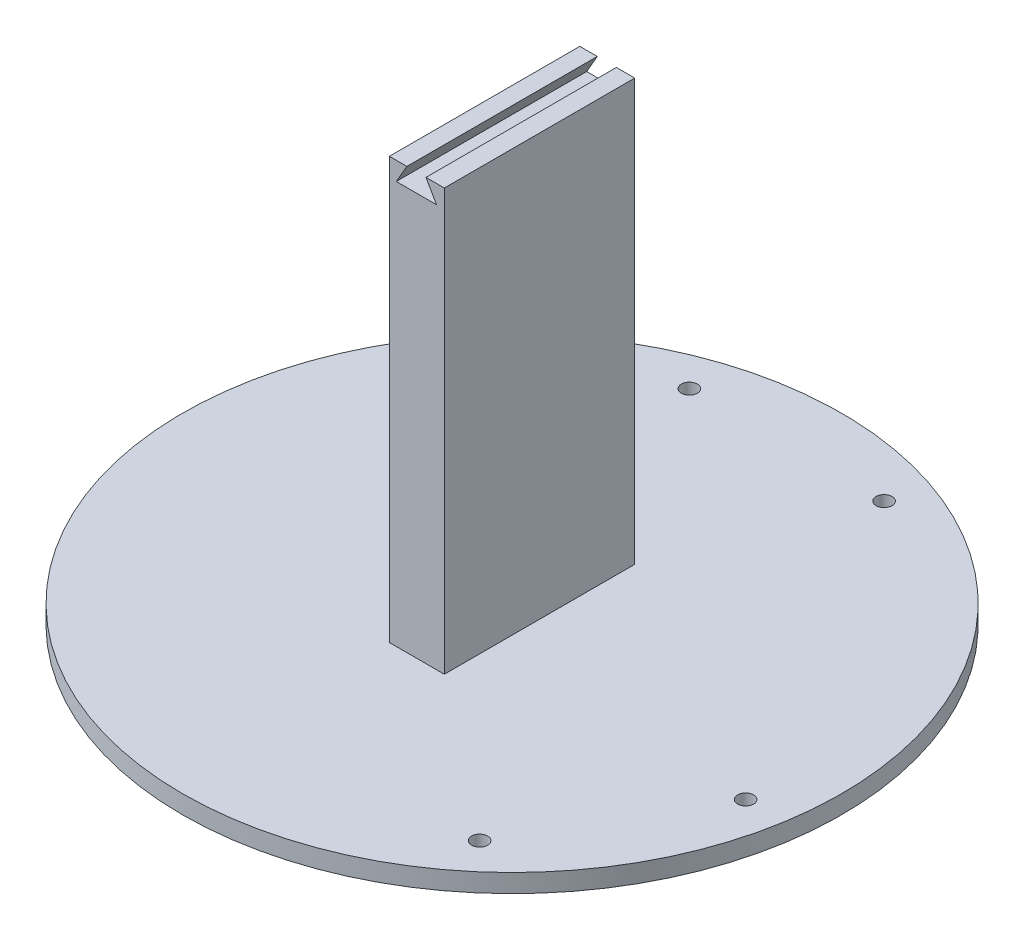
ISO-10303-21;
HEADER;
FILE_DESCRIPTION(('STEP AP214'),'2;1');
FILE_NAME('part.step','',(''),(''),'','','');
FILE_SCHEMA(('AUTOMOTIVE_DESIGN { 1 0 10303 214 1 1 1 1 }'));
ENDSEC;
DATA;
#1=APPLICATION_CONTEXT('core data for automotive mechanical design processes');
#2=APPLICATION_PROTOCOL_DEFINITION('international standard','automotive_design',2000,#1);
#3=PRODUCT_CONTEXT('',#1,'mechanical');
#4=PRODUCT('Part','Part','',(#3));
#5=PRODUCT_RELATED_PRODUCT_CATEGORY('part','',(#4));
#6=PRODUCT_DEFINITION_FORMATION('','',#4);
#7=PRODUCT_DEFINITION_CONTEXT('part definition',#1,'design');
#8=PRODUCT_DEFINITION('design','',#6,#7);
#9=PRODUCT_DEFINITION_SHAPE('','',#8);
#10=(LENGTH_UNIT() NAMED_UNIT(*) SI_UNIT(.MILLI.,.METRE.));
#11=(NAMED_UNIT(*) PLANE_ANGLE_UNIT() SI_UNIT($,.RADIAN.));
#12=(NAMED_UNIT(*) SI_UNIT($,.STERADIAN.) SOLID_ANGLE_UNIT());
#13=UNCERTAINTY_MEASURE_WITH_UNIT(LENGTH_MEASURE(1.E-05),#10,'distance_accuracy_value','');
#14=(GEOMETRIC_REPRESENTATION_CONTEXT(3) GLOBAL_UNCERTAINTY_ASSIGNED_CONTEXT((#13)) GLOBAL_UNIT_ASSIGNED_CONTEXT((#10,
#11,#12)) REPRESENTATION_CONTEXT('',''));
#15=CARTESIAN_POINT('',(0.,0.,0.));
#16=DIRECTION('',(0.,0.,1.));
#17=DIRECTION('',(1.,0.,0.));
#18=AXIS2_PLACEMENT_3D('',#15,#16,#17);
#19=CARTESIAN_POINT('',(0.,120.,0.));
#20=DIRECTION('',(0.,1.,0.));
#21=DIRECTION('',(0.,0.,1.));
#22=AXIS2_PLACEMENT_3D('',#19,#20,#21);
#23=PLANE('',#22);
#24=DIRECTION('',(0.,0.,-1.));
#25=VECTOR('',#24,1.);
#26=CARTESIAN_POINT('',(2.48264412248189,120.,0.));
#27=LINE('',#26,#25);
#28=CARTESIAN_POINT('',(2.48264412248189,120.,26.));
#29=VERTEX_POINT('',#28);
#30=CARTESIAN_POINT('',(2.48264412248189,120.,-26.));
#31=VERTEX_POINT('',#30);
#32=EDGE_CURVE('E11',#29,#31,#27,.T.);
#33=ORIENTED_EDGE('',*,*,#32,.F.);
#34=DIRECTION('',(1.,0.,0.));
#35=VECTOR('',#34,1.);
#36=CARTESIAN_POINT('',(-7.5,120.,26.));
#37=LINE('',#36,#35);
#38=CARTESIAN_POINT('',(7.5,120.,26.));
#39=VERTEX_POINT('',#38);
#40=EDGE_CURVE('E128',#29,#39,#37,.T.);
#41=ORIENTED_EDGE('',*,*,#40,.T.);
#42=DIRECTION('',(0.,0.,-1.));
#43=VECTOR('',#42,1.);
#44=CARTESIAN_POINT('',(7.5,120.,-26.));
#45=LINE('',#44,#43);
#46=CARTESIAN_POINT('',(7.5,120.,-26.));
#47=VERTEX_POINT('',#46);
#48=EDGE_CURVE('E225',#39,#47,#45,.T.);
#49=ORIENTED_EDGE('',*,*,#48,.T.);
#50=DIRECTION('',(-1.,0.,0.));
#51=VECTOR('',#50,1.);
#52=CARTESIAN_POINT('',(-7.5,120.,-26.));
#53=LINE('',#52,#51);
#54=EDGE_CURVE('E234',#47,#31,#53,.T.);
#55=ORIENTED_EDGE('',*,*,#54,.T.);
#56=EDGE_LOOP('',(#33,#41,#49,#55));
#57=FACE_BOUND('',#56,.T.);
#58=ADVANCED_FACE('F40',(#57),#23,.T.);
#59=CARTESIAN_POINT('',(0.,5.,0.));
#60=DIRECTION('',(0.,1.,0.));
#61=DIRECTION('',(0.,0.,1.));
#62=AXIS2_PLACEMENT_3D('',#59,#60,#61);
#63=PLANE('',#62);
#64=CARTESIAN_POINT('',(51.6594052838329,5.,60.5232853596093));
#65=DIRECTION('',(0.,1.,0.));
#66=DIRECTION('',(0.,0.,1.));
#67=AXIS2_PLACEMENT_3D('',#64,#65,#66);
#68=CIRCLE('',#67,2.1825);
#69=CARTESIAN_POINT('',(51.6594052838329,5.,62.7057853596093));
#70=VERTEX_POINT('',#69);
#71=EDGE_CURVE('E121',#70,#70,#68,.T.);
#72=ORIENTED_EDGE('',*,*,#71,.F.);
#73=EDGE_LOOP('',(#72));
#74=FACE_BOUND('',#73,.T.);
#75=CARTESIAN_POINT('',(78.2444052838329,5.,14.4767146403907));
#76=DIRECTION('',(0.,1.,0.));
#77=DIRECTION('',(0.,0.,1.));
#78=AXIS2_PLACEMENT_3D('',#75,#76,#77);
#79=CIRCLE('',#78,2.1825);
#80=CARTESIAN_POINT('',(78.2444052838329,5.,16.6592146403907));
#81=VERTEX_POINT('',#80);
#82=EDGE_CURVE('E307',#81,#81,#79,.T.);
#83=ORIENTED_EDGE('',*,*,#82,.F.);
#84=EDGE_LOOP('',(#83));
#85=FACE_BOUND('',#84,.T.);
#86=CARTESIAN_POINT('',(26.586875,5.,-75.));
#87=DIRECTION('',(0.,1.,0.));
#88=DIRECTION('',(0.,0.,1.));
#89=AXIS2_PLACEMENT_3D('',#86,#87,#88);
#90=CIRCLE('',#89,2.1825);
#91=CARTESIAN_POINT('',(26.586875,5.,-72.8175));
#92=VERTEX_POINT('',#91);
#93=EDGE_CURVE('E291',#92,#92,#90,.T.);
#94=ORIENTED_EDGE('',*,*,#93,.F.);
#95=EDGE_LOOP('',(#94));
#96=FACE_BOUND('',#95,.T.);
#97=CARTESIAN_POINT('',(-26.586875,5.,-75.));
#98=DIRECTION('',(0.,1.,0.));
#99=DIRECTION('',(0.,0.,1.));
#100=AXIS2_PLACEMENT_3D('',#97,#98,#99);
#101=CIRCLE('',#100,2.18255);
#102=CARTESIAN_POINT('',(-26.586875,5.,-72.81745));
#103=VERTEX_POINT('',#102);
#104=EDGE_CURVE('E285',#103,#103,#101,.T.);
#105=ORIENTED_EDGE('',*,*,#104,.F.);
#106=EDGE_LOOP('',(#105));
#107=FACE_BOUND('',#106,.T.);
#108=CARTESIAN_POINT('',(0.,5.,0.));
#109=DIRECTION('',(0.,1.,0.));
#110=DIRECTION('',(0.,0.,1.));
#111=AXIS2_PLACEMENT_3D('',#108,#109,#110);
#112=CIRCLE('',#111,90.);
#113=CARTESIAN_POINT('',(0.,5.,90.));
#114=VERTEX_POINT('',#113);
#115=EDGE_CURVE('E113',#114,#114,#112,.T.);
#116=ORIENTED_EDGE('',*,*,#115,.T.);
#117=EDGE_LOOP('',(#116));
#118=FACE_BOUND('',#117,.T.);
#119=DIRECTION('',(1.,0.,0.));
#120=VECTOR('',#119,1.);
#121=CARTESIAN_POINT('',(0.,5.,-26.));
#122=LINE('',#121,#120);
#123=CARTESIAN_POINT('',(-7.5,5.,-26.));
#124=VERTEX_POINT('',#123);
#125=CARTESIAN_POINT('',(7.5,5.,-26.));
#126=VERTEX_POINT('',#125);
#127=EDGE_CURVE('E155',#124,#126,#122,.T.);
#128=ORIENTED_EDGE('',*,*,#127,.T.);
#129=DIRECTION('',(0.,0.,1.));
#130=VECTOR('',#129,1.);
#131=CARTESIAN_POINT('',(7.5,5.,0.));
#132=LINE('',#131,#130);
#133=CARTESIAN_POINT('',(7.5,5.,26.));
#134=VERTEX_POINT('',#133);
#135=EDGE_CURVE('E159',#126,#134,#132,.T.);
#136=ORIENTED_EDGE('',*,*,#135,.T.);
#137=DIRECTION('',(-1.,0.,0.));
#138=VECTOR('',#137,1.);
#139=CARTESIAN_POINT('',(0.,5.,26.));
#140=LINE('',#139,#138);
#141=CARTESIAN_POINT('',(-7.5,5.,26.));
#142=VERTEX_POINT('',#141);
#143=EDGE_CURVE('E147',#134,#142,#140,.T.);
#144=ORIENTED_EDGE('',*,*,#143,.T.);
#145=DIRECTION('',(0.,0.,-1.));
#146=VECTOR('',#145,1.);
#147=CARTESIAN_POINT('',(-7.5,5.,0.));
#148=LINE('',#147,#146);
#149=EDGE_CURVE('E151',#142,#124,#148,.T.);
#150=ORIENTED_EDGE('',*,*,#149,.T.);
#151=EDGE_LOOP('',(#128,#136,#144,#150));
#152=FACE_BOUND('',#151,.T.);
#153=ADVANCED_FACE('F183',(#74,#85,#96,#107,#118,#152),#63,.T.);
#154=CARTESIAN_POINT('',(0.,5.,0.));
#155=DIRECTION('',(0.,-1.,0.));
#156=DIRECTION('',(0.,0.,-1.));
#157=AXIS2_PLACEMENT_3D('',#154,#155,#156);
#158=CYLINDRICAL_SURFACE('',#157,90.);
#159=ORIENTED_EDGE('',*,*,#115,.F.);
#160=EDGE_LOOP('',(#159));
#161=FACE_BOUND('',#160,.T.);
#162=CARTESIAN_POINT('',(0.,0.,0.));
#163=DIRECTION('',(0.,1.,0.));
#164=DIRECTION('',(0.,0.,1.));
#165=AXIS2_PLACEMENT_3D('',#162,#163,#164);
#166=CIRCLE('',#165,90.);
#167=CARTESIAN_POINT('',(0.,0.,90.));
#168=VERTEX_POINT('',#167);
#169=EDGE_CURVE('E163',#168,#168,#166,.T.);
#170=ORIENTED_EDGE('',*,*,#169,.T.);
#171=EDGE_LOOP('',(#170));
#172=FACE_BOUND('',#171,.T.);
#173=ADVANCED_FACE('F42',(#161,#172),#158,.T.);
#174=CARTESIAN_POINT('',(0.,0.,0.));
#175=DIRECTION('',(0.,1.,0.));
#176=DIRECTION('',(0.,0.,1.));
#177=AXIS2_PLACEMENT_3D('',#174,#175,#176);
#178=PLANE('',#177);
#179=CARTESIAN_POINT('',(51.6594052838329,0.,60.5232853596093));
#180=DIRECTION('',(0.,-1.,0.));
#181=DIRECTION('',(0.,0.,-1.));
#182=AXIS2_PLACEMENT_3D('',#179,#180,#181);
#183=CIRCLE('',#182,2.1825);
#184=CARTESIAN_POINT('',(51.6594052838329,0.,58.3407853596093));
#185=VERTEX_POINT('',#184);
#186=EDGE_CURVE('E283',#185,#185,#183,.T.);
#187=ORIENTED_EDGE('',*,*,#186,.F.);
#188=EDGE_LOOP('',(#187));
#189=FACE_BOUND('',#188,.T.);
#190=CARTESIAN_POINT('',(78.2444052838329,0.,14.4767146403907));
#191=DIRECTION('',(0.,-1.,0.));
#192=DIRECTION('',(0.,0.,-1.));
#193=AXIS2_PLACEMENT_3D('',#190,#191,#192);
#194=CIRCLE('',#193,2.1825);
#195=CARTESIAN_POINT('',(78.2444052838329,0.,12.2942146403907));
#196=VERTEX_POINT('',#195);
#197=EDGE_CURVE('E286',#196,#196,#194,.T.);
#198=ORIENTED_EDGE('',*,*,#197,.F.);
#199=EDGE_LOOP('',(#198));
#200=FACE_BOUND('',#199,.T.);
#201=CARTESIAN_POINT('',(26.586875,0.,-75.));
#202=DIRECTION('',(0.,-1.,0.));
#203=DIRECTION('',(0.,0.,-1.));
#204=AXIS2_PLACEMENT_3D('',#201,#202,#203);
#205=CIRCLE('',#204,2.1825);
#206=CARTESIAN_POINT('',(26.586875,0.,-77.1825));
#207=VERTEX_POINT('',#206);
#208=EDGE_CURVE('E294',#207,#207,#205,.T.);
#209=ORIENTED_EDGE('',*,*,#208,.F.);
#210=EDGE_LOOP('',(#209));
#211=FACE_BOUND('',#210,.T.);
#212=CARTESIAN_POINT('',(-26.586875,0.,-75.));
#213=DIRECTION('',(0.,-1.,0.));
#214=DIRECTION('',(0.,0.,-1.));
#215=AXIS2_PLACEMENT_3D('',#212,#213,#214);
#216=CIRCLE('',#215,2.18255);
#217=CARTESIAN_POINT('',(-26.586875,0.,-77.18255));
#218=VERTEX_POINT('',#217);
#219=EDGE_CURVE('E300',#218,#218,#216,.T.);
#220=ORIENTED_EDGE('',*,*,#219,.F.);
#221=EDGE_LOOP('',(#220));
#222=FACE_BOUND('',#221,.T.);
#223=ORIENTED_EDGE('',*,*,#169,.F.);
#224=EDGE_LOOP('',(#223));
#225=FACE_BOUND('',#224,.T.);
#226=ADVANCED_FACE('F172',(#189,#200,#211,#222,#225),#178,.F.);
#227=CARTESIAN_POINT('',(7.5,120.,-26.));
#228=DIRECTION('',(-1.,0.,0.));
#229=DIRECTION('',(0.,0.,1.));
#230=AXIS2_PLACEMENT_3D('',#227,#228,#229);
#231=PLANE('',#230);
#232=ORIENTED_EDGE('',*,*,#135,.F.);
#233=DIRECTION('',(0.,-1.,0.));
#234=VECTOR('',#233,1.);
#235=CARTESIAN_POINT('',(7.5,120.,-26.));
#236=LINE('',#235,#234);
#237=EDGE_CURVE('E143',#47,#126,#236,.T.);
#238=ORIENTED_EDGE('',*,*,#237,.F.);
#239=ORIENTED_EDGE('',*,*,#48,.F.);
#240=DIRECTION('',(0.,-1.,0.));
#241=VECTOR('',#240,1.);
#242=CARTESIAN_POINT('',(7.5,120.,26.));
#243=LINE('',#242,#241);
#244=EDGE_CURVE('E127',#39,#134,#243,.T.);
#245=ORIENTED_EDGE('',*,*,#244,.T.);
#246=EDGE_LOOP('',(#232,#238,#239,#245));
#247=FACE_BOUND('',#246,.T.);
#248=ADVANCED_FACE('F174',(#247),#231,.F.);
#249=CARTESIAN_POINT('',(-7.5,120.,-26.));
#250=DIRECTION('',(0.,0.,1.));
#251=DIRECTION('',(1.,0.,0.));
#252=AXIS2_PLACEMENT_3D('',#249,#250,#251);
#253=PLANE('',#252);
#254=DIRECTION('',(1.,0.,0.));
#255=VECTOR('',#254,1.);
#256=CARTESIAN_POINT('',(-7.5,114.98,-26.));
#257=LINE('',#256,#255);
#258=CARTESIAN_POINT('',(-5.61905752618617,114.98,-26.));
#259=VERTEX_POINT('',#258);
#260=CARTESIAN_POINT('',(5.38094247381383,114.98,-26.));
#261=VERTEX_POINT('',#260);
#262=EDGE_CURVE('E220',#259,#261,#257,.T.);
#263=ORIENTED_EDGE('',*,*,#262,.T.);
#264=DIRECTION('',(-0.500000000000004,0.866025403784436,0.));
#265=VECTOR('',#264,1.);
#266=CARTESIAN_POINT('',(-0.0130169081386244,124.322611703504,-26.));
#267=LINE('',#266,#265);
#268=EDGE_CURVE('E221',#261,#31,#267,.T.);
#269=ORIENTED_EDGE('',*,*,#268,.T.);
#270=ORIENTED_EDGE('',*,*,#54,.F.);
#271=ORIENTED_EDGE('',*,*,#237,.T.);
#272=ORIENTED_EDGE('',*,*,#127,.F.);
#273=DIRECTION('',(0.,-1.,0.));
#274=VECTOR('',#273,1.);
#275=CARTESIAN_POINT('',(-7.5,120.,-26.));
#276=LINE('',#275,#274);
#277=CARTESIAN_POINT('',(-7.5,120.,-26.));
#278=VERTEX_POINT('',#277);
#279=EDGE_CURVE('E139',#278,#124,#276,.T.);
#280=ORIENTED_EDGE('',*,*,#279,.F.);
#281=CARTESIAN_POINT('',(-2.72075917485427,120.,-26.));
#282=VERTEX_POINT('',#281);
#283=EDGE_CURVE('E230',#282,#278,#53,.T.);
#284=ORIENTED_EDGE('',*,*,#283,.F.);
#285=DIRECTION('',(-0.499999999999998,-0.86602540378444,0.));
#286=VECTOR('',#285,1.);
#287=CARTESIAN_POINT('',(-3.91556938114069,117.93052801731,-26.));
#288=LINE('',#287,#286);
#289=EDGE_CURVE('E56',#282,#259,#288,.T.);
#290=ORIENTED_EDGE('',*,*,#289,.T.);
#291=EDGE_LOOP('',(#263,#269,#270,#271,#272,#280,#284,#290));
#292=FACE_BOUND('',#291,.T.);
#293=ADVANCED_FACE('F180',(#292),#253,.F.);
#294=CARTESIAN_POINT('',(-7.5,120.,-26.));
#295=DIRECTION('',(1.,0.,0.));
#296=DIRECTION('',(0.,0.,-1.));
#297=AXIS2_PLACEMENT_3D('',#294,#295,#296);
#298=PLANE('',#297);
#299=ORIENTED_EDGE('',*,*,#149,.F.);
#300=DIRECTION('',(0.,-1.,0.));
#301=VECTOR('',#300,1.);
#302=CARTESIAN_POINT('',(-7.5,120.,26.));
#303=LINE('',#302,#301);
#304=CARTESIAN_POINT('',(-7.5,120.,26.));
#305=VERTEX_POINT('',#304);
#306=EDGE_CURVE('E64',#305,#142,#303,.T.);
#307=ORIENTED_EDGE('',*,*,#306,.F.);
#308=DIRECTION('',(0.,0.,1.));
#309=VECTOR('',#308,1.);
#310=CARTESIAN_POINT('',(-7.5,120.,-26.));
#311=LINE('',#310,#309);
#312=EDGE_CURVE('E125',#278,#305,#311,.T.);
#313=ORIENTED_EDGE('',*,*,#312,.F.);
#314=ORIENTED_EDGE('',*,*,#279,.T.);
#315=EDGE_LOOP('',(#299,#307,#313,#314));
#316=FACE_BOUND('',#315,.T.);
#317=ADVANCED_FACE('F207',(#316),#298,.F.);
#318=CARTESIAN_POINT('',(-7.5,120.,26.));
#319=DIRECTION('',(0.,0.,-1.));
#320=DIRECTION('',(-1.,0.,0.));
#321=AXIS2_PLACEMENT_3D('',#318,#319,#320);
#322=PLANE('',#321);
#323=ORIENTED_EDGE('',*,*,#40,.F.);
#324=DIRECTION('',(-0.500000000000004,0.866025403784436,0.));
#325=VECTOR('',#324,1.);
#326=CARTESIAN_POINT('',(5.38094247381383,114.98,26.));
#327=LINE('',#326,#325);
#328=CARTESIAN_POINT('',(5.38094247381383,114.98,26.));
#329=VERTEX_POINT('',#328);
#330=EDGE_CURVE('E243',#329,#29,#327,.T.);
#331=ORIENTED_EDGE('',*,*,#330,.F.);
#332=DIRECTION('',(1.,0.,0.));
#333=VECTOR('',#332,1.);
#334=CARTESIAN_POINT('',(-5.61905752618617,114.98,26.));
#335=LINE('',#334,#333);
#336=CARTESIAN_POINT('',(-5.61905752618617,114.98,26.));
#337=VERTEX_POINT('',#336);
#338=EDGE_CURVE('E119',#337,#329,#335,.T.);
#339=ORIENTED_EDGE('',*,*,#338,.F.);
#340=DIRECTION('',(-0.499999999999998,-0.86602540378444,0.));
#341=VECTOR('',#340,1.);
#342=CARTESIAN_POINT('',(-5.61905752618617,114.98,26.));
#343=LINE('',#342,#341);
#344=CARTESIAN_POINT('',(-2.72075917485427,120.,26.));
#345=VERTEX_POINT('',#344);
#346=EDGE_CURVE('E107',#345,#337,#343,.T.);
#347=ORIENTED_EDGE('',*,*,#346,.F.);
#348=EDGE_CURVE('E116',#305,#345,#37,.T.);
#349=ORIENTED_EDGE('',*,*,#348,.F.);
#350=ORIENTED_EDGE('',*,*,#306,.T.);
#351=ORIENTED_EDGE('',*,*,#143,.F.);
#352=ORIENTED_EDGE('',*,*,#244,.F.);
#353=EDGE_LOOP('',(#323,#331,#339,#347,#349,#350,#351,#352));
#354=FACE_BOUND('',#353,.T.);
#355=ADVANCED_FACE('F115',(#354),#322,.F.);
#356=DIRECTION('',(0.,0.,1.));
#357=VECTOR('',#356,1.);
#358=CARTESIAN_POINT('',(-2.72075917485427,120.,0.));
#359=LINE('',#358,#357);
#360=EDGE_CURVE('E49',#282,#345,#359,.T.);
#361=ORIENTED_EDGE('',*,*,#360,.F.);
#362=ORIENTED_EDGE('',*,*,#283,.T.);
#363=ORIENTED_EDGE('',*,*,#312,.T.);
#364=ORIENTED_EDGE('',*,*,#348,.T.);
#365=EDGE_LOOP('',(#361,#362,#363,#364));
#366=FACE_BOUND('',#365,.T.);
#367=ADVANCED_FACE('F123',(#366),#23,.T.);
#368=CARTESIAN_POINT('',(-5.61905752618617,114.98,-54.0000000000001));
#369=DIRECTION('',(0.,-1.,0.));
#370=DIRECTION('',(1.,0.,0.));
#371=AXIS2_PLACEMENT_3D('',#368,#369,#370);
#372=PLANE('',#371);
#373=DIRECTION('',(0.,0.,1.));
#374=VECTOR('',#373,1.);
#375=CARTESIAN_POINT('',(-5.61905752618617,114.98,-54.0000000000001));
#376=LINE('',#375,#374);
#377=EDGE_CURVE('E246',#259,#337,#376,.T.);
#378=ORIENTED_EDGE('',*,*,#377,.T.);
#379=ORIENTED_EDGE('',*,*,#338,.T.);
#380=DIRECTION('',(0.,0.,1.));
#381=VECTOR('',#380,1.);
#382=CARTESIAN_POINT('',(5.38094247381383,114.98,-54.0000000000001));
#383=LINE('',#382,#381);
#384=EDGE_CURVE('E250',#261,#329,#383,.T.);
#385=ORIENTED_EDGE('',*,*,#384,.F.);
#386=ORIENTED_EDGE('',*,*,#262,.F.);
#387=EDGE_LOOP('',(#378,#379,#385,#386));
#388=FACE_BOUND('',#387,.T.);
#389=ADVANCED_FACE('F199',(#388),#372,.F.);
#390=CARTESIAN_POINT('',(5.38094247381383,114.98,-54.0000000000001));
#391=DIRECTION('',(0.866025403784436,0.500000000000004,0.));
#392=DIRECTION('',(-0.500000000000004,0.866025403784436,0.));
#393=AXIS2_PLACEMENT_3D('',#390,#391,#392);
#394=PLANE('',#393);
#395=ORIENTED_EDGE('',*,*,#384,.T.);
#396=ORIENTED_EDGE('',*,*,#330,.T.);
#397=ORIENTED_EDGE('',*,*,#32,.T.);
#398=ORIENTED_EDGE('',*,*,#268,.F.);
#399=EDGE_LOOP('',(#395,#396,#397,#398));
#400=FACE_BOUND('',#399,.T.);
#401=ADVANCED_FACE('F204',(#400),#394,.F.);
#402=CARTESIAN_POINT('',(-5.61905752618617,114.98,-54.0000000000001));
#403=DIRECTION('',(-0.86602540378444,0.499999999999998,0.));
#404=DIRECTION('',(-0.499999999999998,-0.86602540378444,0.));
#405=AXIS2_PLACEMENT_3D('',#402,#403,#404);
#406=PLANE('',#405);
#407=ORIENTED_EDGE('',*,*,#360,.T.);
#408=ORIENTED_EDGE('',*,*,#346,.T.);
#409=ORIENTED_EDGE('',*,*,#377,.F.);
#410=ORIENTED_EDGE('',*,*,#289,.F.);
#411=EDGE_LOOP('',(#407,#408,#409,#410));
#412=FACE_BOUND('',#411,.T.);
#413=ADVANCED_FACE('F106',(#412),#406,.F.);
#414=CARTESIAN_POINT('',(-26.586875,80.0000000000001,-75.));
#415=DIRECTION('',(0.,-1.,0.));
#416=DIRECTION('',(0.,0.,-1.));
#417=AXIS2_PLACEMENT_3D('',#414,#415,#416);
#418=CYLINDRICAL_SURFACE('',#417,2.18255);
#419=ORIENTED_EDGE('',*,*,#104,.T.);
#420=EDGE_LOOP('',(#419));
#421=FACE_BOUND('',#420,.T.);
#422=ORIENTED_EDGE('',*,*,#219,.T.);
#423=EDGE_LOOP('',(#422));
#424=FACE_BOUND('',#423,.T.);
#425=ADVANCED_FACE('F261',(#421,#424),#418,.F.);
#426=CARTESIAN_POINT('',(26.586875,80.0000000000001,-75.));
#427=DIRECTION('',(0.,-1.,0.));
#428=DIRECTION('',(0.,0.,-1.));
#429=AXIS2_PLACEMENT_3D('',#426,#427,#428);
#430=CYLINDRICAL_SURFACE('',#429,2.1825);
#431=ORIENTED_EDGE('',*,*,#93,.T.);
#432=EDGE_LOOP('',(#431));
#433=FACE_BOUND('',#432,.T.);
#434=ORIENTED_EDGE('',*,*,#208,.T.);
#435=EDGE_LOOP('',(#434));
#436=FACE_BOUND('',#435,.T.);
#437=ADVANCED_FACE('F265',(#433,#436),#430,.F.);
#438=CARTESIAN_POINT('',(78.2444052838329,80.0000000000001,14.4767146403907));
#439=DIRECTION('',(0.,-1.,0.));
#440=DIRECTION('',(0.,0.,-1.));
#441=AXIS2_PLACEMENT_3D('',#438,#439,#440);
#442=CYLINDRICAL_SURFACE('',#441,2.1825);
#443=ORIENTED_EDGE('',*,*,#82,.T.);
#444=EDGE_LOOP('',(#443));
#445=FACE_BOUND('',#444,.T.);
#446=ORIENTED_EDGE('',*,*,#197,.T.);
#447=EDGE_LOOP('',(#446));
#448=FACE_BOUND('',#447,.T.);
#449=ADVANCED_FACE('F269',(#445,#448),#442,.F.);
#450=CARTESIAN_POINT('',(51.6594052838329,80.0000000000001,60.5232853596093));
#451=DIRECTION('',(0.,-1.,0.));
#452=DIRECTION('',(0.,0.,-1.));
#453=AXIS2_PLACEMENT_3D('',#450,#451,#452);
#454=CYLINDRICAL_SURFACE('',#453,2.1825);
#455=ORIENTED_EDGE('',*,*,#71,.T.);
#456=EDGE_LOOP('',(#455));
#457=FACE_BOUND('',#456,.T.);
#458=ORIENTED_EDGE('',*,*,#186,.T.);
#459=EDGE_LOOP('',(#458));
#460=FACE_BOUND('',#459,.T.);
#461=ADVANCED_FACE('F273',(#457,#460),#454,.F.);
#462=CLOSED_SHELL('',(#58,#153,#173,#226,#248,#293,#317,#355,#367,#389,#401,#413,#425,#437,#449,#461));
#463=MANIFOLD_SOLID_BREP('B2',#462);
#464=ADVANCED_BREP_SHAPE_REPRESENTATION('',(#18,#463),#14);
#465=SHAPE_DEFINITION_REPRESENTATION(#9,#464);
ENDSEC;
END-ISO-10303-21;
